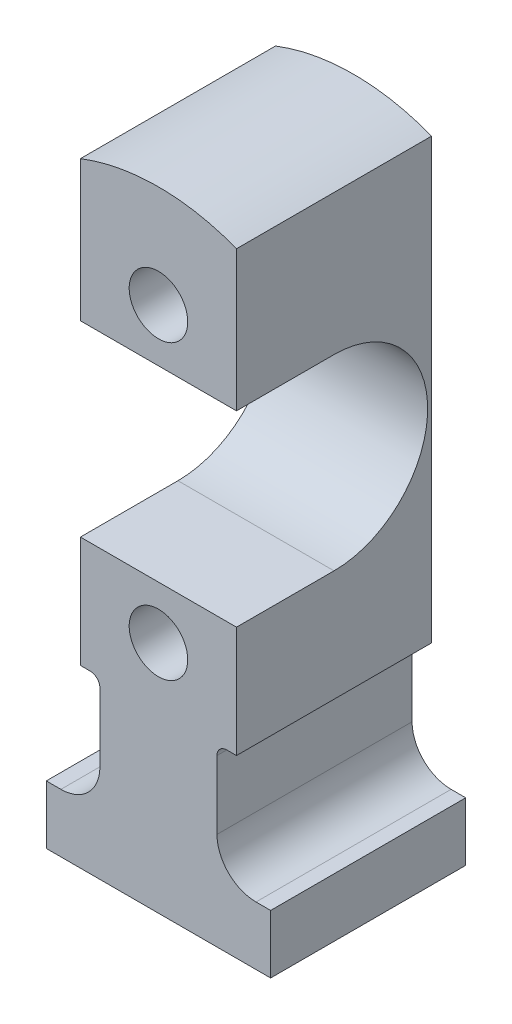
ISO-10303-21;
HEADER;
FILE_DESCRIPTION(('STEP AP214'),'2;1');
FILE_NAME('part.step','',(''),(''),'','','');
FILE_SCHEMA(('AUTOMOTIVE_DESIGN { 1 0 10303 214 1 1 1 1 }'));
ENDSEC;
DATA;
#1=APPLICATION_CONTEXT('core data for automotive mechanical design processes');
#2=APPLICATION_PROTOCOL_DEFINITION('international standard','automotive_design',2000,#1);
#3=PRODUCT_CONTEXT('',#1,'mechanical');
#4=PRODUCT('Part','Part','',(#3));
#5=PRODUCT_RELATED_PRODUCT_CATEGORY('part','',(#4));
#6=PRODUCT_DEFINITION_FORMATION('','',#4);
#7=PRODUCT_DEFINITION_CONTEXT('part definition',#1,'design');
#8=PRODUCT_DEFINITION('design','',#6,#7);
#9=PRODUCT_DEFINITION_SHAPE('','',#8);
#10=(LENGTH_UNIT() NAMED_UNIT(*) SI_UNIT(.MILLI.,.METRE.));
#11=(NAMED_UNIT(*) PLANE_ANGLE_UNIT() SI_UNIT($,.RADIAN.));
#12=(NAMED_UNIT(*) SI_UNIT($,.STERADIAN.) SOLID_ANGLE_UNIT());
#13=UNCERTAINTY_MEASURE_WITH_UNIT(LENGTH_MEASURE(1.E-05),#10,'distance_accuracy_value','');
#14=(GEOMETRIC_REPRESENTATION_CONTEXT(3) GLOBAL_UNCERTAINTY_ASSIGNED_CONTEXT((#13)) GLOBAL_UNIT_ASSIGNED_CONTEXT((#10,
#11,#12)) REPRESENTATION_CONTEXT('',''));
#15=CARTESIAN_POINT('',(0.,0.,0.));
#16=DIRECTION('',(0.,0.,1.));
#17=DIRECTION('',(1.,0.,0.));
#18=AXIS2_PLACEMENT_3D('',#15,#16,#17);
#19=CARTESIAN_POINT('',(0.,0.,100.));
#20=DIRECTION('',(0.,0.,1.));
#21=DIRECTION('',(1.,0.,0.));
#22=AXIS2_PLACEMENT_3D('',#19,#20,#21);
#23=PLANE('',#22);
#24=DIRECTION('',(1.,0.,0.));
#25=VECTOR('',#24,1.);
#26=CARTESIAN_POINT('',(0.,-3.00000000000001,100.));
#27=LINE('',#26,#25);
#28=CARTESIAN_POINT('',(-40.,-3.00000000000001,100.));
#29=VERTEX_POINT('',#28);
#30=CARTESIAN_POINT('',(40.,-3.00000000000001,100.));
#31=VERTEX_POINT('',#30);
#32=EDGE_CURVE('E46',#29,#31,#27,.T.);
#33=ORIENTED_EDGE('',*,*,#32,.F.);
#34=DIRECTION('',(0.,1.,0.));
#35=VECTOR('',#34,1.);
#36=CARTESIAN_POINT('',(-40.,0.,100.));
#37=LINE('',#36,#35);
#38=CARTESIAN_POINT('',(-40.,-60.,100.));
#39=VERTEX_POINT('',#38);
#40=EDGE_CURVE('E197',#39,#29,#37,.T.);
#41=ORIENTED_EDGE('',*,*,#40,.F.);
#42=DIRECTION('',(-1.,0.,0.));
#43=VECTOR('',#42,1.);
#44=CARTESIAN_POINT('',(0.,-60.,100.));
#45=LINE('',#44,#43);
#46=CARTESIAN_POINT('',(-35.,-60.,100.));
#47=VERTEX_POINT('',#46);
#48=EDGE_CURVE('E200',#47,#39,#45,.T.);
#49=ORIENTED_EDGE('',*,*,#48,.F.);
#50=CARTESIAN_POINT('',(-35.,-65.,100.));
#51=DIRECTION('',(0.,0.,1.));
#52=DIRECTION('',(1.,0.,0.));
#53=AXIS2_PLACEMENT_3D('',#50,#51,#52);
#54=CIRCLE('',#53,5.);
#55=CARTESIAN_POINT('',(-30.,-65.,100.));
#56=VERTEX_POINT('',#55);
#57=EDGE_CURVE('E276',#47,#56,#54,.F.);
#58=ORIENTED_EDGE('',*,*,#57,.T.);
#59=DIRECTION('',(0.,1.,0.));
#60=VECTOR('',#59,1.);
#61=CARTESIAN_POINT('',(-30.,0.,100.));
#62=LINE('',#61,#60);
#63=CARTESIAN_POINT('',(-30.,-100.,100.));
#64=VERTEX_POINT('',#63);
#65=EDGE_CURVE('E206',#64,#56,#62,.T.);
#66=ORIENTED_EDGE('',*,*,#65,.F.);
#67=CARTESIAN_POINT('',(-50.,-100.,100.));
#68=DIRECTION('',(0.,0.,1.));
#69=DIRECTION('',(1.,0.,0.));
#70=AXIS2_PLACEMENT_3D('',#67,#68,#69);
#71=CIRCLE('',#70,20.);
#72=CARTESIAN_POINT('',(-50.,-120.,100.));
#73=VERTEX_POINT('',#72);
#74=EDGE_CURVE('E297',#64,#73,#71,.F.);
#75=ORIENTED_EDGE('',*,*,#74,.T.);
#76=DIRECTION('',(-1.,0.,0.));
#77=VECTOR('',#76,1.);
#78=CARTESIAN_POINT('',(0.,-120.,100.));
#79=LINE('',#78,#77);
#80=CARTESIAN_POINT('',(-57.5,-120.,100.));
#81=VERTEX_POINT('',#80);
#82=EDGE_CURVE('E209',#73,#81,#79,.T.);
#83=ORIENTED_EDGE('',*,*,#82,.T.);
#84=DIRECTION('',(0.,-1.,0.));
#85=VECTOR('',#84,1.);
#86=CARTESIAN_POINT('',(-57.4999999999999,0.,100.));
#87=LINE('',#86,#85);
#88=CARTESIAN_POINT('',(-57.5,-150.,100.));
#89=VERTEX_POINT('',#88);
#90=EDGE_CURVE('E211',#81,#89,#87,.T.);
#91=ORIENTED_EDGE('',*,*,#90,.T.);
#92=DIRECTION('',(-1.,0.,0.));
#93=VECTOR('',#92,1.);
#94=CARTESIAN_POINT('',(0.,-150.,100.));
#95=LINE('',#94,#93);
#96=CARTESIAN_POINT('',(57.5,-150.,100.));
#97=VERTEX_POINT('',#96);
#98=EDGE_CURVE('E214',#97,#89,#95,.T.);
#99=ORIENTED_EDGE('',*,*,#98,.F.);
#100=DIRECTION('',(0.,1.,0.));
#101=VECTOR('',#100,1.);
#102=CARTESIAN_POINT('',(57.5,0.,100.));
#103=LINE('',#102,#101);
#104=CARTESIAN_POINT('',(57.5,-120.,100.));
#105=VERTEX_POINT('',#104);
#106=EDGE_CURVE('E217',#97,#105,#103,.T.);
#107=ORIENTED_EDGE('',*,*,#106,.T.);
#108=CARTESIAN_POINT('',(50.,-120.,100.));
#109=VERTEX_POINT('',#108);
#110=EDGE_CURVE('E212',#105,#109,#79,.T.);
#111=ORIENTED_EDGE('',*,*,#110,.T.);
#112=CARTESIAN_POINT('',(50.,-100.,100.));
#113=DIRECTION('',(0.,0.,1.));
#114=DIRECTION('',(1.,0.,0.));
#115=AXIS2_PLACEMENT_3D('',#112,#113,#114);
#116=CIRCLE('',#115,20.);
#117=CARTESIAN_POINT('',(30.,-100.,100.));
#118=VERTEX_POINT('',#117);
#119=EDGE_CURVE('E182',#109,#118,#116,.F.);
#120=ORIENTED_EDGE('',*,*,#119,.T.);
#121=DIRECTION('',(0.,1.,0.));
#122=VECTOR('',#121,1.);
#123=CARTESIAN_POINT('',(30.,0.,100.));
#124=LINE('',#123,#122);
#125=CARTESIAN_POINT('',(30.,-65.,100.));
#126=VERTEX_POINT('',#125);
#127=EDGE_CURVE('E219',#118,#126,#124,.T.);
#128=ORIENTED_EDGE('',*,*,#127,.T.);
#129=CARTESIAN_POINT('',(35.,-65.,100.));
#130=DIRECTION('',(0.,0.,1.));
#131=DIRECTION('',(1.,0.,0.));
#132=AXIS2_PLACEMENT_3D('',#129,#130,#131);
#133=CIRCLE('',#132,5.);
#134=CARTESIAN_POINT('',(35.,-60.,100.));
#135=VERTEX_POINT('',#134);
#136=EDGE_CURVE('E288',#126,#135,#133,.F.);
#137=ORIENTED_EDGE('',*,*,#136,.T.);
#138=CARTESIAN_POINT('',(40.,-60.,100.));
#139=VERTEX_POINT('',#138);
#140=EDGE_CURVE('E207',#139,#135,#45,.T.);
#141=ORIENTED_EDGE('',*,*,#140,.F.);
#142=DIRECTION('',(0.,1.,0.));
#143=VECTOR('',#142,1.);
#144=CARTESIAN_POINT('',(40.,0.,100.));
#145=LINE('',#144,#143);
#146=EDGE_CURVE('E201',#139,#31,#145,.T.);
#147=ORIENTED_EDGE('',*,*,#146,.T.);
#148=EDGE_LOOP('',(#33,#41,#49,#58,#66,#75,#83,#91,#99,#107,#111,#120,#128,#137,#141,#147));
#149=FACE_BOUND('',#148,.T.);
#150=CARTESIAN_POINT('',(0.,-30.,100.));
#151=DIRECTION('',(0.,0.,1.));
#152=DIRECTION('',(1.,0.,0.));
#153=AXIS2_PLACEMENT_3D('',#150,#151,#152);
#154=CIRCLE('',#153,15.);
#155=CARTESIAN_POINT('',(15.,-30.,100.));
#156=VERTEX_POINT('',#155);
#157=EDGE_CURVE('E333',#156,#156,#154,.T.);
#158=ORIENTED_EDGE('',*,*,#157,.F.);
#159=EDGE_LOOP('',(#158));
#160=FACE_BOUND('',#159,.T.);
#161=ADVANCED_FACE('F38',(#149,#160),#23,.T.);
#162=CARTESIAN_POINT('',(40.,0.,100.));
#163=DIRECTION('',(-1.,0.,0.));
#164=DIRECTION('',(0.,0.,1.));
#165=AXIS2_PLACEMENT_3D('',#162,#163,#164);
#166=PLANE('',#165);
#167=CARTESIAN_POINT('',(40.,45.,50.));
#168=DIRECTION('',(-1.,0.,0.));
#169=DIRECTION('',(0.,0.,1.));
#170=AXIS2_PLACEMENT_3D('',#167,#168,#169);
#171=CIRCLE('',#170,48.);
#172=CARTESIAN_POINT('',(40.,93.,50.));
#173=VERTEX_POINT('',#172);
#174=CARTESIAN_POINT('',(40.,-3.00000000000001,50.));
#175=VERTEX_POINT('',#174);
#176=EDGE_CURVE('E321',#173,#175,#171,.T.);
#177=ORIENTED_EDGE('',*,*,#176,.T.);
#178=DIRECTION('',(0.,0.,1.));
#179=VECTOR('',#178,1.);
#180=CARTESIAN_POINT('',(40.,-3.00000000000001,100.));
#181=LINE('',#180,#179);
#182=EDGE_CURVE('E310',#175,#31,#181,.T.);
#183=ORIENTED_EDGE('',*,*,#182,.T.);
#184=ORIENTED_EDGE('',*,*,#146,.F.);
#185=DIRECTION('',(0.,0.,-1.));
#186=VECTOR('',#185,1.);
#187=CARTESIAN_POINT('',(40.,-60.,100.));
#188=LINE('',#187,#186);
#189=CARTESIAN_POINT('',(40.,-60.,0.));
#190=VERTEX_POINT('',#189);
#191=EDGE_CURVE('E249',#139,#190,#188,.T.);
#192=ORIENTED_EDGE('',*,*,#191,.T.);
#193=DIRECTION('',(0.,1.,0.));
#194=VECTOR('',#193,1.);
#195=CARTESIAN_POINT('',(40.,0.,0.));
#196=LINE('',#195,#194);
#197=CARTESIAN_POINT('',(40.,164.983908243078,0.));
#198=VERTEX_POINT('',#197);
#199=EDGE_CURVE('E221',#190,#198,#196,.T.);
#200=ORIENTED_EDGE('',*,*,#199,.T.);
#201=DIRECTION('',(0.,0.,-1.));
#202=VECTOR('',#201,1.);
#203=CARTESIAN_POINT('',(40.,164.983908243078,100.));
#204=LINE('',#203,#202);
#205=CARTESIAN_POINT('',(40.,164.983908243078,100.));
#206=VERTEX_POINT('',#205);
#207=EDGE_CURVE('E266',#206,#198,#204,.T.);
#208=ORIENTED_EDGE('',*,*,#207,.F.);
#209=CARTESIAN_POINT('',(40.,93.,100.));
#210=VERTEX_POINT('',#209);
#211=EDGE_CURVE('E325',#210,#206,#145,.T.);
#212=ORIENTED_EDGE('',*,*,#211,.F.);
#213=DIRECTION('',(0.,0.,-1.));
#214=VECTOR('',#213,1.);
#215=CARTESIAN_POINT('',(40.,93.,100.));
#216=LINE('',#215,#214);
#217=EDGE_CURVE('E53',#210,#173,#216,.T.);
#218=ORIENTED_EDGE('',*,*,#217,.T.);
#219=EDGE_LOOP('',(#177,#183,#184,#192,#200,#208,#212,#218));
#220=FACE_BOUND('',#219,.T.);
#221=ADVANCED_FACE('F319',(#220),#166,.F.);
#222=CARTESIAN_POINT('',(0.,62.0132821407043,100.));
#223=DIRECTION('',(0.,0.,-1.));
#224=DIRECTION('',(-1.,0.,0.));
#225=AXIS2_PLACEMENT_3D('',#222,#223,#224);
#226=CYLINDRICAL_SURFACE('',#225,110.466962662666);
#227=CARTESIAN_POINT('',(0.,62.0132821407043,0.));
#228=DIRECTION('',(0.,0.,1.));
#229=DIRECTION('',(1.,0.,0.));
#230=AXIS2_PLACEMENT_3D('',#227,#228,#229);
#231=CIRCLE('',#230,110.466962662666);
#232=CARTESIAN_POINT('',(-40.,164.983908243078,0.));
#233=VERTEX_POINT('',#232);
#234=EDGE_CURVE('E224',#198,#233,#231,.T.);
#235=ORIENTED_EDGE('',*,*,#234,.T.);
#236=DIRECTION('',(0.,0.,-1.));
#237=VECTOR('',#236,1.);
#238=CARTESIAN_POINT('',(-40.,164.983908243078,100.));
#239=LINE('',#238,#237);
#240=CARTESIAN_POINT('',(-40.,164.983908243078,100.));
#241=VERTEX_POINT('',#240);
#242=EDGE_CURVE('E264',#241,#233,#239,.T.);
#243=ORIENTED_EDGE('',*,*,#242,.F.);
#244=CARTESIAN_POINT('',(0.,62.0132821407043,100.));
#245=DIRECTION('',(0.,0.,1.));
#246=DIRECTION('',(1.,0.,0.));
#247=AXIS2_PLACEMENT_3D('',#244,#245,#246);
#248=CIRCLE('',#247,110.466962662666);
#249=EDGE_CURVE('E195',#206,#241,#248,.T.);
#250=ORIENTED_EDGE('',*,*,#249,.F.);
#251=ORIENTED_EDGE('',*,*,#207,.T.);
#252=EDGE_LOOP('',(#235,#243,#250,#251));
#253=FACE_BOUND('',#252,.T.);
#254=ADVANCED_FACE('F406',(#253),#226,.T.);
#255=CARTESIAN_POINT('',(-40.,0.,100.));
#256=DIRECTION('',(-1.,0.,0.));
#257=DIRECTION('',(0.,0.,1.));
#258=AXIS2_PLACEMENT_3D('',#255,#256,#257);
#259=PLANE('',#258);
#260=DIRECTION('',(0.,0.,1.));
#261=VECTOR('',#260,1.);
#262=CARTESIAN_POINT('',(-40.,-3.00000000000001,100.));
#263=LINE('',#262,#261);
#264=CARTESIAN_POINT('',(-40.,-3.00000000000001,50.));
#265=VERTEX_POINT('',#264);
#266=EDGE_CURVE('E312',#265,#29,#263,.T.);
#267=ORIENTED_EDGE('',*,*,#266,.F.);
#268=CARTESIAN_POINT('',(-40.,45.,50.));
#269=DIRECTION('',(-1.,0.,0.));
#270=DIRECTION('',(0.,0.,1.));
#271=AXIS2_PLACEMENT_3D('',#268,#269,#270);
#272=CIRCLE('',#271,48.);
#273=CARTESIAN_POINT('',(-40.,93.,50.));
#274=VERTEX_POINT('',#273);
#275=EDGE_CURVE('E11',#274,#265,#272,.T.);
#276=ORIENTED_EDGE('',*,*,#275,.F.);
#277=DIRECTION('',(0.,0.,-1.));
#278=VECTOR('',#277,1.);
#279=CARTESIAN_POINT('',(-40.,93.,100.));
#280=LINE('',#279,#278);
#281=CARTESIAN_POINT('',(-40.,93.,100.));
#282=VERTEX_POINT('',#281);
#283=EDGE_CURVE('E177',#282,#274,#280,.T.);
#284=ORIENTED_EDGE('',*,*,#283,.F.);
#285=EDGE_CURVE('E188',#282,#241,#37,.T.);
#286=ORIENTED_EDGE('',*,*,#285,.T.);
#287=ORIENTED_EDGE('',*,*,#242,.T.);
#288=DIRECTION('',(0.,1.,0.));
#289=VECTOR('',#288,1.);
#290=CARTESIAN_POINT('',(-40.,0.,0.));
#291=LINE('',#290,#289);
#292=CARTESIAN_POINT('',(-40.,-60.,0.));
#293=VERTEX_POINT('',#292);
#294=EDGE_CURVE('E228',#293,#233,#291,.T.);
#295=ORIENTED_EDGE('',*,*,#294,.F.);
#296=DIRECTION('',(0.,0.,-1.));
#297=VECTOR('',#296,1.);
#298=CARTESIAN_POINT('',(-40.,-60.,100.));
#299=LINE('',#298,#297);
#300=EDGE_CURVE('E261',#39,#293,#299,.T.);
#301=ORIENTED_EDGE('',*,*,#300,.F.);
#302=ORIENTED_EDGE('',*,*,#40,.T.);
#303=EDGE_LOOP('',(#267,#276,#284,#286,#287,#295,#301,#302));
#304=FACE_BOUND('',#303,.T.);
#305=ADVANCED_FACE('F187',(#304),#259,.T.);
#306=CARTESIAN_POINT('',(0.,-60.,100.));
#307=DIRECTION('',(0.,-1.,0.));
#308=DIRECTION('',(1.,0.,0.));
#309=AXIS2_PLACEMENT_3D('',#306,#307,#308);
#310=PLANE('',#309);
#311=DIRECTION('',(-1.,0.,0.));
#312=VECTOR('',#311,1.);
#313=CARTESIAN_POINT('',(0.,-60.,0.));
#314=LINE('',#313,#312);
#315=CARTESIAN_POINT('',(-35.,-60.,0.));
#316=VERTEX_POINT('',#315);
#317=EDGE_CURVE('E231',#316,#293,#314,.T.);
#318=ORIENTED_EDGE('',*,*,#317,.F.);
#319=DIRECTION('',(0.,0.,-1.));
#320=VECTOR('',#319,1.);
#321=CARTESIAN_POINT('',(-35.,-60.,100.));
#322=LINE('',#321,#320);
#323=EDGE_CURVE('E272',#316,#47,#322,.F.);
#324=ORIENTED_EDGE('',*,*,#323,.T.);
#325=ORIENTED_EDGE('',*,*,#48,.T.);
#326=ORIENTED_EDGE('',*,*,#300,.T.);
#327=EDGE_LOOP('',(#318,#324,#325,#326));
#328=FACE_BOUND('',#327,.T.);
#329=ADVANCED_FACE('F413',(#328),#310,.T.);
#330=CARTESIAN_POINT('',(-30.,0.,100.));
#331=DIRECTION('',(-1.,0.,0.));
#332=DIRECTION('',(0.,0.,1.));
#333=AXIS2_PLACEMENT_3D('',#330,#331,#332);
#334=PLANE('',#333);
#335=DIRECTION('',(0.,1.,0.));
#336=VECTOR('',#335,1.);
#337=CARTESIAN_POINT('',(-30.,0.,0.));
#338=LINE('',#337,#336);
#339=CARTESIAN_POINT('',(-30.,-100.,0.));
#340=VERTEX_POINT('',#339);
#341=CARTESIAN_POINT('',(-30.,-65.,0.));
#342=VERTEX_POINT('',#341);
#343=EDGE_CURVE('E233',#340,#342,#338,.T.);
#344=ORIENTED_EDGE('',*,*,#343,.F.);
#345=DIRECTION('',(0.,0.,-1.));
#346=VECTOR('',#345,1.);
#347=CARTESIAN_POINT('',(-30.,-100.,100.));
#348=LINE('',#347,#346);
#349=EDGE_CURVE('E293',#340,#64,#348,.F.);
#350=ORIENTED_EDGE('',*,*,#349,.T.);
#351=ORIENTED_EDGE('',*,*,#65,.T.);
#352=DIRECTION('',(0.,0.,-1.));
#353=VECTOR('',#352,1.);
#354=CARTESIAN_POINT('',(-30.,-65.,0.));
#355=LINE('',#354,#353);
#356=EDGE_CURVE('E269',#56,#342,#355,.T.);
#357=ORIENTED_EDGE('',*,*,#356,.T.);
#358=EDGE_LOOP('',(#344,#350,#351,#357));
#359=FACE_BOUND('',#358,.T.);
#360=ADVANCED_FACE('F358',(#359),#334,.T.);
#361=CARTESIAN_POINT('',(0.,-120.,100.));
#362=DIRECTION('',(0.,-1.,0.));
#363=DIRECTION('',(1.,0.,0.));
#364=AXIS2_PLACEMENT_3D('',#361,#362,#363);
#365=PLANE('',#364);
#366=ORIENTED_EDGE('',*,*,#82,.F.);
#367=DIRECTION('',(0.,0.,-1.));
#368=VECTOR('',#367,1.);
#369=CARTESIAN_POINT('',(-50.,-120.,100.));
#370=LINE('',#369,#368);
#371=CARTESIAN_POINT('',(-50.,-120.,0.));
#372=VERTEX_POINT('',#371);
#373=EDGE_CURVE('E290',#73,#372,#370,.T.);
#374=ORIENTED_EDGE('',*,*,#373,.T.);
#375=DIRECTION('',(-1.,0.,0.));
#376=VECTOR('',#375,1.);
#377=CARTESIAN_POINT('',(0.,-120.,0.));
#378=LINE('',#377,#376);
#379=CARTESIAN_POINT('',(-57.5,-120.,0.));
#380=VERTEX_POINT('',#379);
#381=EDGE_CURVE('E236',#372,#380,#378,.T.);
#382=ORIENTED_EDGE('',*,*,#381,.T.);
#383=DIRECTION('',(0.,0.,-1.));
#384=VECTOR('',#383,1.);
#385=CARTESIAN_POINT('',(-57.5,-120.,100.));
#386=LINE('',#385,#384);
#387=EDGE_CURVE('E258',#81,#380,#386,.T.);
#388=ORIENTED_EDGE('',*,*,#387,.F.);
#389=EDGE_LOOP('',(#366,#374,#382,#388));
#390=FACE_BOUND('',#389,.T.);
#391=ADVANCED_FACE('F367',(#390),#365,.F.);
#392=CARTESIAN_POINT('',(-57.4999999999999,0.,100.));
#393=DIRECTION('',(1.,0.,0.));
#394=DIRECTION('',(0.,1.,0.));
#395=AXIS2_PLACEMENT_3D('',#392,#393,#394);
#396=PLANE('',#395);
#397=DIRECTION('',(0.,-1.,0.));
#398=VECTOR('',#397,1.);
#399=CARTESIAN_POINT('',(-57.4999999999999,0.,0.));
#400=LINE('',#399,#398);
#401=CARTESIAN_POINT('',(-57.5,-150.,0.));
#402=VERTEX_POINT('',#401);
#403=EDGE_CURVE('E238',#380,#402,#400,.T.);
#404=ORIENTED_EDGE('',*,*,#403,.T.);
#405=DIRECTION('',(0.,0.,-1.));
#406=VECTOR('',#405,1.);
#407=CARTESIAN_POINT('',(-57.5,-150.,100.));
#408=LINE('',#407,#406);
#409=EDGE_CURVE('E256',#89,#402,#408,.T.);
#410=ORIENTED_EDGE('',*,*,#409,.F.);
#411=ORIENTED_EDGE('',*,*,#90,.F.);
#412=ORIENTED_EDGE('',*,*,#387,.T.);
#413=EDGE_LOOP('',(#404,#410,#411,#412));
#414=FACE_BOUND('',#413,.T.);
#415=ADVANCED_FACE('F377',(#414),#396,.F.);
#416=CARTESIAN_POINT('',(0.,-150.,100.));
#417=DIRECTION('',(0.,-1.,0.));
#418=DIRECTION('',(0.,0.,-1.));
#419=AXIS2_PLACEMENT_3D('',#416,#417,#418);
#420=PLANE('',#419);
#421=DIRECTION('',(-1.,0.,0.));
#422=VECTOR('',#421,1.);
#423=CARTESIAN_POINT('',(0.,-150.,0.));
#424=LINE('',#423,#422);
#425=CARTESIAN_POINT('',(57.5,-150.,0.));
#426=VERTEX_POINT('',#425);
#427=EDGE_CURVE('E242',#426,#402,#424,.T.);
#428=ORIENTED_EDGE('',*,*,#427,.F.);
#429=DIRECTION('',(0.,0.,-1.));
#430=VECTOR('',#429,1.);
#431=CARTESIAN_POINT('',(57.5,-150.,100.));
#432=LINE('',#431,#430);
#433=EDGE_CURVE('E254',#97,#426,#432,.T.);
#434=ORIENTED_EDGE('',*,*,#433,.F.);
#435=ORIENTED_EDGE('',*,*,#98,.T.);
#436=ORIENTED_EDGE('',*,*,#409,.T.);
#437=EDGE_LOOP('',(#428,#434,#435,#436));
#438=FACE_BOUND('',#437,.T.);
#439=ADVANCED_FACE('F383',(#438),#420,.T.);
#440=CARTESIAN_POINT('',(57.5,0.,100.));
#441=DIRECTION('',(-1.,0.,0.));
#442=DIRECTION('',(0.,0.,1.));
#443=AXIS2_PLACEMENT_3D('',#440,#441,#442);
#444=PLANE('',#443);
#445=DIRECTION('',(0.,1.,0.));
#446=VECTOR('',#445,1.);
#447=CARTESIAN_POINT('',(57.5,0.,0.));
#448=LINE('',#447,#446);
#449=CARTESIAN_POINT('',(57.5,-120.,0.));
#450=VERTEX_POINT('',#449);
#451=EDGE_CURVE('E245',#426,#450,#448,.T.);
#452=ORIENTED_EDGE('',*,*,#451,.T.);
#453=DIRECTION('',(0.,0.,-1.));
#454=VECTOR('',#453,1.);
#455=CARTESIAN_POINT('',(57.5,-120.,100.));
#456=LINE('',#455,#454);
#457=EDGE_CURVE('E251',#105,#450,#456,.T.);
#458=ORIENTED_EDGE('',*,*,#457,.F.);
#459=ORIENTED_EDGE('',*,*,#106,.F.);
#460=ORIENTED_EDGE('',*,*,#433,.T.);
#461=EDGE_LOOP('',(#452,#458,#459,#460));
#462=FACE_BOUND('',#461,.T.);
#463=ADVANCED_FACE('F385',(#462),#444,.F.);
#464=CARTESIAN_POINT('',(50.,-120.,0.));
#465=VERTEX_POINT('',#464);
#466=EDGE_CURVE('E239',#450,#465,#378,.T.);
#467=ORIENTED_EDGE('',*,*,#466,.T.);
#468=DIRECTION('',(0.,0.,-1.));
#469=VECTOR('',#468,1.);
#470=CARTESIAN_POINT('',(50.,-120.,100.));
#471=LINE('',#470,#469);
#472=EDGE_CURVE('E61',#465,#109,#471,.F.);
#473=ORIENTED_EDGE('',*,*,#472,.T.);
#474=ORIENTED_EDGE('',*,*,#110,.F.);
#475=ORIENTED_EDGE('',*,*,#457,.T.);
#476=EDGE_LOOP('',(#467,#473,#474,#475));
#477=FACE_BOUND('',#476,.T.);
#478=ADVANCED_FACE('F387',(#477),#365,.F.);
#479=CARTESIAN_POINT('',(30.,0.,100.));
#480=DIRECTION('',(-1.,0.,0.));
#481=DIRECTION('',(0.,0.,1.));
#482=AXIS2_PLACEMENT_3D('',#479,#480,#481);
#483=PLANE('',#482);
#484=ORIENTED_EDGE('',*,*,#127,.F.);
#485=DIRECTION('',(0.,0.,-1.));
#486=VECTOR('',#485,1.);
#487=CARTESIAN_POINT('',(30.,-100.,0.));
#488=LINE('',#487,#486);
#489=CARTESIAN_POINT('',(30.,-100.,0.));
#490=VERTEX_POINT('',#489);
#491=EDGE_CURVE('E299',#118,#490,#488,.T.);
#492=ORIENTED_EDGE('',*,*,#491,.T.);
#493=DIRECTION('',(0.,1.,0.));
#494=VECTOR('',#493,1.);
#495=CARTESIAN_POINT('',(30.,0.,0.));
#496=LINE('',#495,#494);
#497=CARTESIAN_POINT('',(30.,-65.,0.));
#498=VERTEX_POINT('',#497);
#499=EDGE_CURVE('E247',#490,#498,#496,.T.);
#500=ORIENTED_EDGE('',*,*,#499,.T.);
#501=DIRECTION('',(0.,0.,-1.));
#502=VECTOR('',#501,1.);
#503=CARTESIAN_POINT('',(30.,-65.,100.));
#504=LINE('',#503,#502);
#505=EDGE_CURVE('E282',#498,#126,#504,.F.);
#506=ORIENTED_EDGE('',*,*,#505,.T.);
#507=EDGE_LOOP('',(#484,#492,#500,#506));
#508=FACE_BOUND('',#507,.T.);
#509=ADVANCED_FACE('F394',(#508),#483,.F.);
#510=ORIENTED_EDGE('',*,*,#140,.T.);
#511=DIRECTION('',(0.,0.,-1.));
#512=VECTOR('',#511,1.);
#513=CARTESIAN_POINT('',(35.,-60.,100.));
#514=LINE('',#513,#512);
#515=CARTESIAN_POINT('',(35.,-60.,0.));
#516=VERTEX_POINT('',#515);
#517=EDGE_CURVE('E279',#135,#516,#514,.T.);
#518=ORIENTED_EDGE('',*,*,#517,.T.);
#519=EDGE_CURVE('E234',#190,#516,#314,.T.);
#520=ORIENTED_EDGE('',*,*,#519,.F.);
#521=ORIENTED_EDGE('',*,*,#191,.F.);
#522=EDGE_LOOP('',(#510,#518,#520,#521));
#523=FACE_BOUND('',#522,.T.);
#524=ADVANCED_FACE('F403',(#523),#310,.T.);
#525=DIRECTION('',(-1.,0.,0.));
#526=VECTOR('',#525,1.);
#527=CARTESIAN_POINT('',(0.,93.,100.));
#528=LINE('',#527,#526);
#529=EDGE_CURVE('E174',#210,#282,#528,.T.);
#530=ORIENTED_EDGE('',*,*,#529,.F.);
#531=ORIENTED_EDGE('',*,*,#211,.T.);
#532=ORIENTED_EDGE('',*,*,#249,.T.);
#533=ORIENTED_EDGE('',*,*,#285,.F.);
#534=EDGE_LOOP('',(#530,#531,#532,#533));
#535=FACE_BOUND('',#534,.T.);
#536=CARTESIAN_POINT('',(0.,120.,100.));
#537=DIRECTION('',(0.,0.,1.));
#538=DIRECTION('',(1.,0.,0.));
#539=AXIS2_PLACEMENT_3D('',#536,#537,#538);
#540=CIRCLE('',#539,15.);
#541=CARTESIAN_POINT('',(15.,120.,100.));
#542=VERTEX_POINT('',#541);
#543=EDGE_CURVE('E327',#542,#542,#540,.T.);
#544=ORIENTED_EDGE('',*,*,#543,.F.);
#545=EDGE_LOOP('',(#544));
#546=FACE_BOUND('',#545,.T.);
#547=ADVANCED_FACE('F192',(#535,#546),#23,.T.);
#548=CARTESIAN_POINT('',(0.,0.,0.));
#549=DIRECTION('',(0.,0.,1.));
#550=DIRECTION('',(1.,0.,0.));
#551=AXIS2_PLACEMENT_3D('',#548,#549,#550);
#552=PLANE('',#551);
#553=CARTESIAN_POINT('',(0.,-30.,0.));
#554=DIRECTION('',(0.,0.,1.));
#555=DIRECTION('',(1.,0.,0.));
#556=AXIS2_PLACEMENT_3D('',#553,#554,#555);
#557=CIRCLE('',#556,15.);
#558=CARTESIAN_POINT('',(15.,-30.,0.));
#559=VERTEX_POINT('',#558);
#560=EDGE_CURVE('E330',#559,#559,#557,.T.);
#561=ORIENTED_EDGE('',*,*,#560,.T.);
#562=EDGE_LOOP('',(#561));
#563=FACE_BOUND('',#562,.T.);
#564=CARTESIAN_POINT('',(0.,120.,0.));
#565=DIRECTION('',(0.,0.,1.));
#566=DIRECTION('',(1.,0.,0.));
#567=AXIS2_PLACEMENT_3D('',#564,#565,#566);
#568=CIRCLE('',#567,15.);
#569=CARTESIAN_POINT('',(15.,120.,0.));
#570=VERTEX_POINT('',#569);
#571=EDGE_CURVE('E225',#570,#570,#568,.T.);
#572=ORIENTED_EDGE('',*,*,#571,.T.);
#573=EDGE_LOOP('',(#572));
#574=FACE_BOUND('',#573,.T.);
#575=ORIENTED_EDGE('',*,*,#199,.F.);
#576=ORIENTED_EDGE('',*,*,#519,.T.);
#577=CARTESIAN_POINT('',(35.,-65.,0.));
#578=DIRECTION('',(0.,0.,1.));
#579=DIRECTION('',(1.,0.,0.));
#580=AXIS2_PLACEMENT_3D('',#577,#578,#579);
#581=CIRCLE('',#580,5.);
#582=EDGE_CURVE('E285',#516,#498,#581,.T.);
#583=ORIENTED_EDGE('',*,*,#582,.T.);
#584=ORIENTED_EDGE('',*,*,#499,.F.);
#585=CARTESIAN_POINT('',(50.,-100.,0.));
#586=DIRECTION('',(0.,0.,1.));
#587=DIRECTION('',(1.,0.,0.));
#588=AXIS2_PLACEMENT_3D('',#585,#586,#587);
#589=CIRCLE('',#588,20.);
#590=EDGE_CURVE('E303',#490,#465,#589,.T.);
#591=ORIENTED_EDGE('',*,*,#590,.T.);
#592=ORIENTED_EDGE('',*,*,#466,.F.);
#593=ORIENTED_EDGE('',*,*,#451,.F.);
#594=ORIENTED_EDGE('',*,*,#427,.T.);
#595=ORIENTED_EDGE('',*,*,#403,.F.);
#596=ORIENTED_EDGE('',*,*,#381,.F.);
#597=CARTESIAN_POINT('',(-50.,-100.,0.));
#598=DIRECTION('',(0.,0.,1.));
#599=DIRECTION('',(1.,0.,0.));
#600=AXIS2_PLACEMENT_3D('',#597,#598,#599);
#601=CIRCLE('',#600,20.);
#602=EDGE_CURVE('E295',#372,#340,#601,.T.);
#603=ORIENTED_EDGE('',*,*,#602,.T.);
#604=ORIENTED_EDGE('',*,*,#343,.T.);
#605=CARTESIAN_POINT('',(-35.,-65.,0.));
#606=DIRECTION('',(0.,0.,1.));
#607=DIRECTION('',(1.,0.,0.));
#608=AXIS2_PLACEMENT_3D('',#605,#606,#607);
#609=CIRCLE('',#608,5.);
#610=EDGE_CURVE('E274',#342,#316,#609,.T.);
#611=ORIENTED_EDGE('',*,*,#610,.T.);
#612=ORIENTED_EDGE('',*,*,#317,.T.);
#613=ORIENTED_EDGE('',*,*,#294,.T.);
#614=ORIENTED_EDGE('',*,*,#234,.F.);
#615=EDGE_LOOP('',(#575,#576,#583,#584,#591,#592,#593,#594,#595,#596,#603,#604,#611,#612,#613,#614));
#616=FACE_BOUND('',#615,.T.);
#617=ADVANCED_FACE('F372',(#563,#574,#616),#552,.F.);
#618=CARTESIAN_POINT('',(-35.,-65.,100.));
#619=DIRECTION('',(0.,0.,1.));
#620=DIRECTION('',(1.,0.,0.));
#621=AXIS2_PLACEMENT_3D('',#618,#619,#620);
#622=CYLINDRICAL_SURFACE('',#621,5.);
#623=ORIENTED_EDGE('',*,*,#57,.F.);
#624=ORIENTED_EDGE('',*,*,#323,.F.);
#625=ORIENTED_EDGE('',*,*,#610,.F.);
#626=ORIENTED_EDGE('',*,*,#356,.F.);
#627=EDGE_LOOP('',(#623,#624,#625,#626));
#628=FACE_BOUND('',#627,.T.);
#629=ADVANCED_FACE('F354',(#628),#622,.F.);
#630=CARTESIAN_POINT('',(35.,-65.,100.));
#631=DIRECTION('',(0.,0.,-1.));
#632=DIRECTION('',(-1.,0.,0.));
#633=AXIS2_PLACEMENT_3D('',#630,#631,#632);
#634=CYLINDRICAL_SURFACE('',#633,5.);
#635=ORIENTED_EDGE('',*,*,#136,.F.);
#636=ORIENTED_EDGE('',*,*,#505,.F.);
#637=ORIENTED_EDGE('',*,*,#582,.F.);
#638=ORIENTED_EDGE('',*,*,#517,.F.);
#639=EDGE_LOOP('',(#635,#636,#637,#638));
#640=FACE_BOUND('',#639,.T.);
#641=ADVANCED_FACE('F401',(#640),#634,.F.);
#642=CARTESIAN_POINT('',(-50.,-100.,100.));
#643=DIRECTION('',(0.,0.,-1.));
#644=DIRECTION('',(-1.,0.,0.));
#645=AXIS2_PLACEMENT_3D('',#642,#643,#644);
#646=CYLINDRICAL_SURFACE('',#645,20.);
#647=ORIENTED_EDGE('',*,*,#74,.F.);
#648=ORIENTED_EDGE('',*,*,#349,.F.);
#649=ORIENTED_EDGE('',*,*,#602,.F.);
#650=ORIENTED_EDGE('',*,*,#373,.F.);
#651=EDGE_LOOP('',(#647,#648,#649,#650));
#652=FACE_BOUND('',#651,.T.);
#653=ADVANCED_FACE('F364',(#652),#646,.F.);
#654=CARTESIAN_POINT('',(50.,-100.,100.));
#655=DIRECTION('',(0.,0.,1.));
#656=DIRECTION('',(1.,0.,0.));
#657=AXIS2_PLACEMENT_3D('',#654,#655,#656);
#658=CYLINDRICAL_SURFACE('',#657,20.);
#659=ORIENTED_EDGE('',*,*,#119,.F.);
#660=ORIENTED_EDGE('',*,*,#472,.F.);
#661=ORIENTED_EDGE('',*,*,#590,.F.);
#662=ORIENTED_EDGE('',*,*,#491,.F.);
#663=EDGE_LOOP('',(#659,#660,#661,#662));
#664=FACE_BOUND('',#663,.T.);
#665=ADVANCED_FACE('F40',(#664),#658,.F.);
#666=CARTESIAN_POINT('',(0.,120.,0.));
#667=DIRECTION('',(0.,0.,1.));
#668=DIRECTION('',(1.,0.,0.));
#669=AXIS2_PLACEMENT_3D('',#666,#667,#668);
#670=CYLINDRICAL_SURFACE('',#669,15.);
#671=ORIENTED_EDGE('',*,*,#571,.F.);
#672=EDGE_LOOP('',(#671));
#673=FACE_BOUND('',#672,.T.);
#674=ORIENTED_EDGE('',*,*,#543,.T.);
#675=EDGE_LOOP('',(#674));
#676=FACE_BOUND('',#675,.T.);
#677=ADVANCED_FACE('F470',(#673,#676),#670,.F.);
#678=CARTESIAN_POINT('',(0.,-30.,0.));
#679=DIRECTION('',(0.,0.,1.));
#680=DIRECTION('',(1.,0.,0.));
#681=AXIS2_PLACEMENT_3D('',#678,#679,#680);
#682=CYLINDRICAL_SURFACE('',#681,15.);
#683=ORIENTED_EDGE('',*,*,#560,.F.);
#684=EDGE_LOOP('',(#683));
#685=FACE_BOUND('',#684,.T.);
#686=ORIENTED_EDGE('',*,*,#157,.T.);
#687=EDGE_LOOP('',(#686));
#688=FACE_BOUND('',#687,.T.);
#689=ADVANCED_FACE('F480',(#685,#688),#682,.F.);
#690=CARTESIAN_POINT('',(-57.5,45.,50.));
#691=DIRECTION('',(1.,0.,0.));
#692=DIRECTION('',(0.,0.,-1.));
#693=AXIS2_PLACEMENT_3D('',#690,#691,#692);
#694=CYLINDRICAL_SURFACE('',#693,48.);
#695=DIRECTION('',(1.,0.,0.));
#696=VECTOR('',#695,1.);
#697=CARTESIAN_POINT('',(-57.5,93.,50.));
#698=LINE('',#697,#696);
#699=EDGE_CURVE('E341',#274,#173,#698,.T.);
#700=ORIENTED_EDGE('',*,*,#699,.F.);
#701=ORIENTED_EDGE('',*,*,#275,.T.);
#702=DIRECTION('',(1.,0.,0.));
#703=VECTOR('',#702,1.);
#704=CARTESIAN_POINT('',(-57.5,-3.00000000000001,50.));
#705=LINE('',#704,#703);
#706=EDGE_CURVE('E190',#265,#175,#705,.T.);
#707=ORIENTED_EDGE('',*,*,#706,.T.);
#708=ORIENTED_EDGE('',*,*,#176,.F.);
#709=EDGE_LOOP('',(#700,#701,#707,#708));
#710=FACE_BOUND('',#709,.T.);
#711=ADVANCED_FACE('F344',(#710),#694,.F.);
#712=CARTESIAN_POINT('',(-57.5,-3.00000000000001,50.));
#713=DIRECTION('',(0.,-1.,0.));
#714=DIRECTION('',(0.,0.,-1.));
#715=AXIS2_PLACEMENT_3D('',#712,#713,#714);
#716=PLANE('',#715);
#717=ORIENTED_EDGE('',*,*,#706,.F.);
#718=ORIENTED_EDGE('',*,*,#266,.T.);
#719=ORIENTED_EDGE('',*,*,#32,.T.);
#720=ORIENTED_EDGE('',*,*,#182,.F.);
#721=EDGE_LOOP('',(#717,#718,#719,#720));
#722=FACE_BOUND('',#721,.T.);
#723=ADVANCED_FACE('F309',(#722),#716,.F.);
#724=CARTESIAN_POINT('',(-57.5,93.,50.));
#725=DIRECTION('',(0.,1.,0.));
#726=DIRECTION('',(0.,0.,1.));
#727=AXIS2_PLACEMENT_3D('',#724,#725,#726);
#728=PLANE('',#727);
#729=ORIENTED_EDGE('',*,*,#529,.T.);
#730=ORIENTED_EDGE('',*,*,#283,.T.);
#731=ORIENTED_EDGE('',*,*,#699,.T.);
#732=ORIENTED_EDGE('',*,*,#217,.F.);
#733=EDGE_LOOP('',(#729,#730,#731,#732));
#734=FACE_BOUND('',#733,.T.);
#735=ADVANCED_FACE('F176',(#734),#728,.F.);
#736=CLOSED_SHELL('',(#161,#221,#254,#305,#329,#360,#391,#415,#439,#463,#478,#509,#524,#547,
#617,#629,#641,#653,#665,#677,#689,#711,#723,#735));
#737=MANIFOLD_SOLID_BREP('B2',#736);
#738=ADVANCED_BREP_SHAPE_REPRESENTATION('',(#18,#737),#14);
#739=SHAPE_DEFINITION_REPRESENTATION(#9,#738);
ENDSEC;
END-ISO-10303-21;
